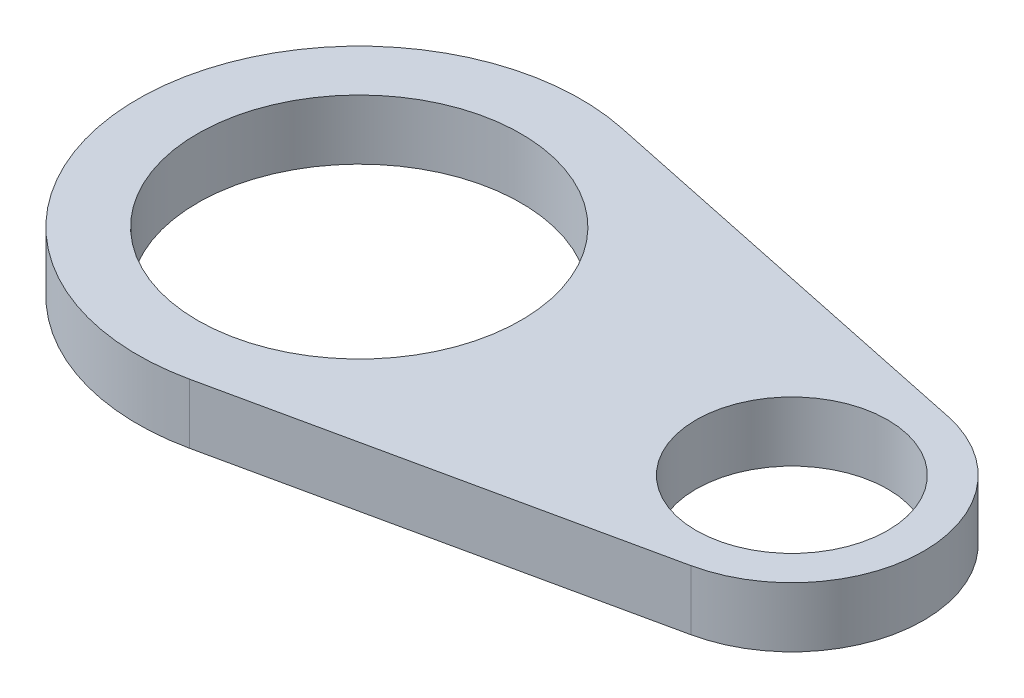
ISO-10303-21;
HEADER;
FILE_DESCRIPTION(('STEP AP214'),'2;1');
FILE_NAME('part.step','',(''),(''),'','','');
FILE_SCHEMA(('AUTOMOTIVE_DESIGN { 1 0 10303 214 1 1 1 1 }'));
ENDSEC;
DATA;
#1=APPLICATION_CONTEXT('core data for automotive mechanical design processes');
#2=APPLICATION_PROTOCOL_DEFINITION('international standard','automotive_design',2000,#1);
#3=PRODUCT_CONTEXT('',#1,'mechanical');
#4=PRODUCT('Part','Part','',(#3));
#5=PRODUCT_RELATED_PRODUCT_CATEGORY('part','',(#4));
#6=PRODUCT_DEFINITION_FORMATION('','',#4);
#7=PRODUCT_DEFINITION_CONTEXT('part definition',#1,'design');
#8=PRODUCT_DEFINITION('design','',#6,#7);
#9=PRODUCT_DEFINITION_SHAPE('','',#8);
#10=(LENGTH_UNIT() NAMED_UNIT(*) SI_UNIT(.MILLI.,.METRE.));
#11=(NAMED_UNIT(*) PLANE_ANGLE_UNIT() SI_UNIT($,.RADIAN.));
#12=(NAMED_UNIT(*) SI_UNIT($,.STERADIAN.) SOLID_ANGLE_UNIT());
#13=UNCERTAINTY_MEASURE_WITH_UNIT(LENGTH_MEASURE(1.E-05),#10,'distance_accuracy_value','');
#14=(GEOMETRIC_REPRESENTATION_CONTEXT(3) GLOBAL_UNCERTAINTY_ASSIGNED_CONTEXT((#13)) GLOBAL_UNIT_ASSIGNED_CONTEXT((#10,
#11,#12)) REPRESENTATION_CONTEXT('',''));
#15=CARTESIAN_POINT('',(0.,0.,0.));
#16=DIRECTION('',(0.,0.,1.));
#17=DIRECTION('',(1.,0.,0.));
#18=AXIS2_PLACEMENT_3D('',#15,#16,#17);
#19=CARTESIAN_POINT('',(36.,0.,-0.117478220276513));
#20=DIRECTION('',(0.,1.,0.));
#21=DIRECTION('',(0.,0.,1.));
#22=AXIS2_PLACEMENT_3D('',#19,#20,#21);
#23=CYLINDRICAL_SURFACE('',#22,11.);
#24=CARTESIAN_POINT('',(36.,5.,-0.117478220276513));
#25=DIRECTION('',(0.,1.,0.));
#26=DIRECTION('',(0.,0.,1.));
#27=AXIS2_PLACEMENT_3D('',#24,#25,#26);
#28=CIRCLE('',#27,11.);
#29=CARTESIAN_POINT('',(38.3267505703953,5.,10.6336255269285));
#30=VERTEX_POINT('',#29);
#31=CARTESIAN_POINT('',(38.2565339554413,5.,-10.8835385260681));
#32=VERTEX_POINT('',#31);
#33=EDGE_CURVE('E96',#30,#32,#28,.T.);
#34=ORIENTED_EDGE('',*,*,#33,.F.);
#35=DIRECTION('',(0.,1.,0.));
#36=VECTOR('',#35,1.);
#37=CARTESIAN_POINT('',(38.3267505703953,0.,10.6336255269285));
#38=LINE('',#37,#36);
#39=CARTESIAN_POINT('',(38.3267505703953,0.,10.6336255269285));
#40=VERTEX_POINT('',#39);
#41=EDGE_CURVE('E98',#40,#30,#38,.T.);
#42=ORIENTED_EDGE('',*,*,#41,.F.);
#43=CARTESIAN_POINT('',(36.,0.,-0.117478220276513));
#44=DIRECTION('',(0.,1.,0.));
#45=DIRECTION('',(0.,0.,1.));
#46=AXIS2_PLACEMENT_3D('',#43,#44,#45);
#47=CIRCLE('',#46,11.);
#48=CARTESIAN_POINT('',(38.2565339554413,0.,-10.8835385260681));
#49=VERTEX_POINT('',#48);
#50=EDGE_CURVE('E127',#40,#49,#47,.T.);
#51=ORIENTED_EDGE('',*,*,#50,.T.);
#52=DIRECTION('',(0.,1.,0.));
#53=VECTOR('',#52,1.);
#54=CARTESIAN_POINT('',(38.2565339554413,0.,-10.8835385260681));
#55=LINE('',#54,#53);
#56=EDGE_CURVE('E90',#49,#32,#55,.T.);
#57=ORIENTED_EDGE('',*,*,#56,.T.);
#58=EDGE_LOOP('',(#34,#42,#51,#57));
#59=FACE_BOUND('',#58,.T.);
#60=ADVANCED_FACE('F45',(#59),#23,.T.);
#61=CARTESIAN_POINT('',(0.,5.,0.));
#62=DIRECTION('',(0.,-1.,0.));
#63=DIRECTION('',(0.,0.,-1.));
#64=AXIS2_PLACEMENT_3D('',#61,#62,#63);
#65=CYLINDRICAL_SURFACE('',#64,18.5);
#66=CARTESIAN_POINT('',(0.,0.,0.));
#67=DIRECTION('',(0.,1.,0.));
#68=DIRECTION('',(0.,0.,1.));
#69=AXIS2_PLACEMENT_3D('',#66,#67,#68);
#70=CIRCLE('',#69,18.5);
#71=CARTESIAN_POINT('',(3.79507983415125,0.,-18.1065559688313));
#72=VERTEX_POINT('',#71);
#73=CARTESIAN_POINT('',(3.9131714138466,0.,18.0814017566629));
#74=VERTEX_POINT('',#73);
#75=EDGE_CURVE('E49',#72,#74,#70,.T.);
#76=ORIENTED_EDGE('',*,*,#75,.T.);
#77=DIRECTION('',(0.,1.,0.));
#78=VECTOR('',#77,1.);
#79=CARTESIAN_POINT('',(3.9131714138466,0.,18.0814017566629));
#80=LINE('',#79,#78);
#81=CARTESIAN_POINT('',(3.9131714138466,5.,18.0814017566629));
#82=VERTEX_POINT('',#81);
#83=EDGE_CURVE('E102',#74,#82,#80,.T.);
#84=ORIENTED_EDGE('',*,*,#83,.T.);
#85=CARTESIAN_POINT('',(0.,5.,0.));
#86=DIRECTION('',(0.,1.,0.));
#87=DIRECTION('',(0.,0.,1.));
#88=AXIS2_PLACEMENT_3D('',#85,#86,#87);
#89=CIRCLE('',#88,18.5);
#90=CARTESIAN_POINT('',(3.79507983415125,5.,-18.1065559688313));
#91=VERTEX_POINT('',#90);
#92=EDGE_CURVE('E11',#91,#82,#89,.T.);
#93=ORIENTED_EDGE('',*,*,#92,.F.);
#94=DIRECTION('',(0.,1.,0.));
#95=VECTOR('',#94,1.);
#96=CARTESIAN_POINT('',(3.79507983415125,0.,-18.1065559688313));
#97=LINE('',#96,#95);
#98=EDGE_CURVE('E79',#72,#91,#97,.T.);
#99=ORIENTED_EDGE('',*,*,#98,.F.);
#100=EDGE_LOOP('',(#76,#84,#93,#99));
#101=FACE_BOUND('',#100,.T.);
#102=ADVANCED_FACE('F47',(#101),#65,.T.);
#103=CARTESIAN_POINT('',(0.,5.,0.));
#104=DIRECTION('',(0.,1.,0.));
#105=DIRECTION('',(0.,0.,1.));
#106=AXIS2_PLACEMENT_3D('',#103,#104,#105);
#107=PLANE('',#106);
#108=DIRECTION('',(0.977373067927727,0.,-0.211522779126843));
#109=VECTOR('',#108,1.);
#110=CARTESIAN_POINT('',(38.3267505703953,5.,10.6336255269285));
#111=LINE('',#110,#109);
#112=EDGE_CURVE('E60',#82,#30,#111,.T.);
#113=ORIENTED_EDGE('',*,*,#112,.T.);
#114=ORIENTED_EDGE('',*,*,#33,.T.);
#115=DIRECTION('',(-0.978732755071959,0.,-0.205139450494662));
#116=VECTOR('',#115,1.);
#117=CARTESIAN_POINT('',(38.2565339554413,5.,-10.8835385260681));
#118=LINE('',#117,#116);
#119=EDGE_CURVE('E82',#32,#91,#118,.T.);
#120=ORIENTED_EDGE('',*,*,#119,.T.);
#121=ORIENTED_EDGE('',*,*,#92,.T.);
#122=EDGE_LOOP('',(#113,#114,#120,#121));
#123=FACE_BOUND('',#122,.T.);
#124=CARTESIAN_POINT('',(36.,5.,-0.117478220276513));
#125=DIRECTION('',(0.,1.,0.));
#126=DIRECTION('',(0.,0.,1.));
#127=AXIS2_PLACEMENT_3D('',#124,#125,#126);
#128=CIRCLE('',#127,8.);
#129=CARTESIAN_POINT('',(36.,5.,7.88252177972349));
#130=VERTEX_POINT('',#129);
#131=EDGE_CURVE('E89',#130,#130,#128,.T.);
#132=ORIENTED_EDGE('',*,*,#131,.F.);
#133=EDGE_LOOP('',(#132));
#134=FACE_BOUND('',#133,.T.);
#135=CARTESIAN_POINT('',(0.,5.,0.));
#136=DIRECTION('',(0.,1.,0.));
#137=DIRECTION('',(0.,0.,1.));
#138=AXIS2_PLACEMENT_3D('',#135,#136,#137);
#139=CIRCLE('',#138,13.5);
#140=CARTESIAN_POINT('',(0.,5.,13.5));
#141=VERTEX_POINT('',#140);
#142=EDGE_CURVE('E133',#141,#141,#139,.T.);
#143=ORIENTED_EDGE('',*,*,#142,.F.);
#144=EDGE_LOOP('',(#143));
#145=FACE_BOUND('',#144,.T.);
#146=ADVANCED_FACE('F92',(#123,#134,#145),#107,.T.);
#147=CARTESIAN_POINT('',(0.,0.,0.));
#148=DIRECTION('',(0.,1.,0.));
#149=DIRECTION('',(0.,0.,1.));
#150=AXIS2_PLACEMENT_3D('',#147,#148,#149);
#151=PLANE('',#150);
#152=ORIENTED_EDGE('',*,*,#50,.F.);
#153=DIRECTION('',(0.977373067927727,0.,-0.211522779126843));
#154=VECTOR('',#153,1.);
#155=CARTESIAN_POINT('',(38.3267505703953,0.,10.6336255269285));
#156=LINE('',#155,#154);
#157=EDGE_CURVE('E108',#74,#40,#156,.T.);
#158=ORIENTED_EDGE('',*,*,#157,.F.);
#159=ORIENTED_EDGE('',*,*,#75,.F.);
#160=DIRECTION('',(-0.978732755071959,0.,-0.205139450494662));
#161=VECTOR('',#160,1.);
#162=CARTESIAN_POINT('',(38.2565339554413,0.,-10.8835385260681));
#163=LINE('',#162,#161);
#164=EDGE_CURVE('E69',#49,#72,#163,.T.);
#165=ORIENTED_EDGE('',*,*,#164,.F.);
#166=EDGE_LOOP('',(#152,#158,#159,#165));
#167=FACE_BOUND('',#166,.T.);
#168=CARTESIAN_POINT('',(36.,0.,-0.117478220276513));
#169=DIRECTION('',(0.,1.,0.));
#170=DIRECTION('',(0.,0.,1.));
#171=AXIS2_PLACEMENT_3D('',#168,#169,#170);
#172=CIRCLE('',#171,8.);
#173=CARTESIAN_POINT('',(36.,0.,7.88252177972349));
#174=VERTEX_POINT('',#173);
#175=EDGE_CURVE('E120',#174,#174,#172,.T.);
#176=ORIENTED_EDGE('',*,*,#175,.T.);
#177=EDGE_LOOP('',(#176));
#178=FACE_BOUND('',#177,.T.);
#179=CARTESIAN_POINT('',(0.,0.,0.));
#180=DIRECTION('',(0.,1.,0.));
#181=DIRECTION('',(0.,0.,1.));
#182=AXIS2_PLACEMENT_3D('',#179,#180,#181);
#183=CIRCLE('',#182,13.5);
#184=CARTESIAN_POINT('',(0.,0.,13.5));
#185=VERTEX_POINT('',#184);
#186=EDGE_CURVE('E130',#185,#185,#183,.T.);
#187=ORIENTED_EDGE('',*,*,#186,.T.);
#188=EDGE_LOOP('',(#187));
#189=FACE_BOUND('',#188,.T.);
#190=ADVANCED_FACE('F141',(#167,#178,#189),#151,.F.);
#191=CARTESIAN_POINT('',(0.,5.,0.));
#192=DIRECTION('',(0.,-1.,0.));
#193=DIRECTION('',(0.,0.,-1.));
#194=AXIS2_PLACEMENT_3D('',#191,#192,#193);
#195=CYLINDRICAL_SURFACE('',#194,13.5);
#196=ORIENTED_EDGE('',*,*,#142,.T.);
#197=EDGE_LOOP('',(#196));
#198=FACE_BOUND('',#197,.T.);
#199=ORIENTED_EDGE('',*,*,#186,.F.);
#200=EDGE_LOOP('',(#199));
#201=FACE_BOUND('',#200,.T.);
#202=ADVANCED_FACE('F143',(#198,#201),#195,.F.);
#203=CARTESIAN_POINT('',(36.,0.,-0.117478220276513));
#204=DIRECTION('',(0.,1.,0.));
#205=DIRECTION('',(0.,0.,1.));
#206=AXIS2_PLACEMENT_3D('',#203,#204,#205);
#207=CYLINDRICAL_SURFACE('',#206,8.);
#208=ORIENTED_EDGE('',*,*,#175,.F.);
#209=EDGE_LOOP('',(#208));
#210=FACE_BOUND('',#209,.T.);
#211=ORIENTED_EDGE('',*,*,#131,.T.);
#212=EDGE_LOOP('',(#211));
#213=FACE_BOUND('',#212,.T.);
#214=ADVANCED_FACE('F145',(#210,#213),#207,.F.);
#215=CARTESIAN_POINT('',(38.2565339554413,0.,-10.8835385260681));
#216=DIRECTION('',(0.205139450494662,0.,-0.97873275507196));
#217=DIRECTION('',(-0.97873275507196,0.,-0.205139450494662));
#218=AXIS2_PLACEMENT_3D('',#215,#216,#217);
#219=PLANE('',#218);
#220=ORIENTED_EDGE('',*,*,#119,.F.);
#221=ORIENTED_EDGE('',*,*,#56,.F.);
#222=ORIENTED_EDGE('',*,*,#164,.T.);
#223=ORIENTED_EDGE('',*,*,#98,.T.);
#224=EDGE_LOOP('',(#220,#221,#222,#223));
#225=FACE_BOUND('',#224,.T.);
#226=ADVANCED_FACE('F81',(#225),#219,.T.);
#227=CARTESIAN_POINT('',(38.3267505703953,0.,10.6336255269285));
#228=DIRECTION('',(0.211522779126843,0.,0.977373067927727));
#229=DIRECTION('',(0.977373067927727,0.,-0.211522779126843));
#230=AXIS2_PLACEMENT_3D('',#227,#228,#229);
#231=PLANE('',#230);
#232=ORIENTED_EDGE('',*,*,#112,.F.);
#233=ORIENTED_EDGE('',*,*,#83,.F.);
#234=ORIENTED_EDGE('',*,*,#157,.T.);
#235=ORIENTED_EDGE('',*,*,#41,.T.);
#236=EDGE_LOOP('',(#232,#233,#234,#235));
#237=FACE_BOUND('',#236,.T.);
#238=ADVANCED_FACE('F165',(#237),#231,.T.);
#239=CLOSED_SHELL('',(#60,#102,#146,#190,#202,#214,#226,#238));
#240=MANIFOLD_SOLID_BREP('B2',#239);
#241=ADVANCED_BREP_SHAPE_REPRESENTATION('',(#18,#240),#14);
#242=SHAPE_DEFINITION_REPRESENTATION(#9,#241);
ENDSEC;
END-ISO-10303-21;
